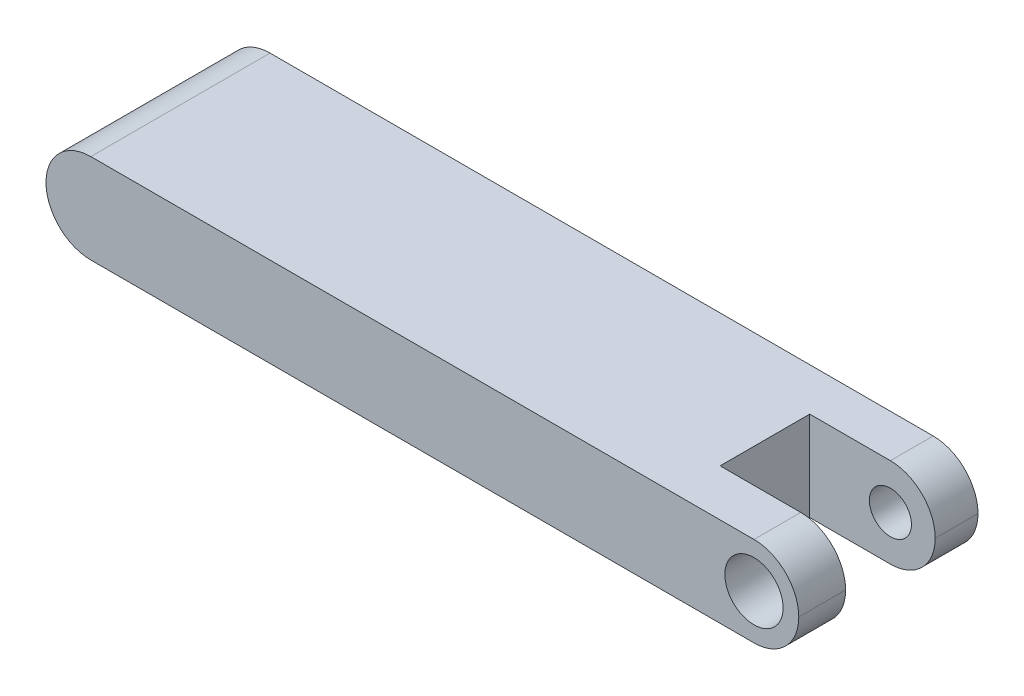
ISO-10303-21;
HEADER;
FILE_DESCRIPTION(('STEP AP214'),'2;1');
FILE_NAME('part.step','',(''),(''),'','','');
FILE_SCHEMA(('AUTOMOTIVE_DESIGN { 1 0 10303 214 1 1 1 1 }'));
ENDSEC;
DATA;
#1=APPLICATION_CONTEXT('core data for automotive mechanical design processes');
#2=APPLICATION_PROTOCOL_DEFINITION('international standard','automotive_design',2000,#1);
#3=PRODUCT_CONTEXT('',#1,'mechanical');
#4=PRODUCT('Part','Part','',(#3));
#5=PRODUCT_RELATED_PRODUCT_CATEGORY('part','',(#4));
#6=PRODUCT_DEFINITION_FORMATION('','',#4);
#7=PRODUCT_DEFINITION_CONTEXT('part definition',#1,'design');
#8=PRODUCT_DEFINITION('design','',#6,#7);
#9=PRODUCT_DEFINITION_SHAPE('','',#8);
#10=(LENGTH_UNIT() NAMED_UNIT(*) SI_UNIT(.MILLI.,.METRE.));
#11=(NAMED_UNIT(*) PLANE_ANGLE_UNIT() SI_UNIT($,.RADIAN.));
#12=(NAMED_UNIT(*) SI_UNIT($,.STERADIAN.) SOLID_ANGLE_UNIT());
#13=UNCERTAINTY_MEASURE_WITH_UNIT(LENGTH_MEASURE(1.E-05),#10,'distance_accuracy_value','');
#14=(GEOMETRIC_REPRESENTATION_CONTEXT(3) GLOBAL_UNCERTAINTY_ASSIGNED_CONTEXT((#13)) GLOBAL_UNIT_ASSIGNED_CONTEXT((#10,
#11,#12)) REPRESENTATION_CONTEXT('',''));
#15=CARTESIAN_POINT('',(0.,0.,0.));
#16=DIRECTION('',(0.,0.,1.));
#17=DIRECTION('',(1.,0.,0.));
#18=AXIS2_PLACEMENT_3D('',#15,#16,#17);
#19=CARTESIAN_POINT('',(11.176,1.27,0.));
#20=DIRECTION('',(0.,0.,1.));
#21=DIRECTION('',(1.,0.,0.));
#22=AXIS2_PLACEMENT_3D('',#19,#20,#21);
#23=CYLINDRICAL_SURFACE('',#22,1.27);
#24=CARTESIAN_POINT('',(11.176,1.27,-3.86681438128154));
#25=DIRECTION('',(0.,0.,-1.));
#26=DIRECTION('',(-1.,0.,0.));
#27=AXIS2_PLACEMENT_3D('',#24,#25,#26);
#28=CIRCLE('',#27,1.27);
#29=CARTESIAN_POINT('',(12.446,1.27,-3.86681438128154));
#30=VERTEX_POINT('',#29);
#31=CARTESIAN_POINT('',(11.176,2.54,-3.86681438128154));
#32=VERTEX_POINT('',#31);
#33=EDGE_CURVE('E158',#30,#32,#28,.F.);
#34=ORIENTED_EDGE('',*,*,#33,.F.);
#35=DIRECTION('',(0.,0.,-1.));
#36=VECTOR('',#35,1.);
#37=CARTESIAN_POINT('',(12.446,1.27,0.));
#38=LINE('',#37,#36);
#39=CARTESIAN_POINT('',(12.446,1.27,-5.08));
#40=VERTEX_POINT('',#39);
#41=EDGE_CURVE('E172',#40,#30,#38,.F.);
#42=ORIENTED_EDGE('',*,*,#41,.F.);
#43=CARTESIAN_POINT('',(11.176,1.27,-5.08));
#44=DIRECTION('',(0.,0.,1.));
#45=DIRECTION('',(1.,0.,0.));
#46=AXIS2_PLACEMENT_3D('',#43,#44,#45);
#47=CIRCLE('',#46,1.27);
#48=CARTESIAN_POINT('',(11.176,2.54,-5.08));
#49=VERTEX_POINT('',#48);
#50=EDGE_CURVE('E178',#49,#40,#47,.F.);
#51=ORIENTED_EDGE('',*,*,#50,.F.);
#52=DIRECTION('',(0.,0.,-1.));
#53=VECTOR('',#52,1.);
#54=CARTESIAN_POINT('',(11.176,2.54,-5.08));
#55=LINE('',#54,#53);
#56=EDGE_CURVE('E197',#32,#49,#55,.T.);
#57=ORIENTED_EDGE('',*,*,#56,.F.);
#58=EDGE_LOOP('',(#34,#42,#51,#57));
#59=FACE_BOUND('',#58,.T.);
#60=ADVANCED_FACE('F36',(#59),#23,.T.);
#61=CARTESIAN_POINT('',(11.176,1.27,0.));
#62=DIRECTION('',(0.,0.,-1.));
#63=DIRECTION('',(-1.,0.,0.));
#64=AXIS2_PLACEMENT_3D('',#61,#62,#63);
#65=CYLINDRICAL_SURFACE('',#64,1.27);
#66=CARTESIAN_POINT('',(11.176,1.27,-3.86681438128154));
#67=DIRECTION('',(0.,0.,-1.));
#68=DIRECTION('',(-1.,0.,0.));
#69=AXIS2_PLACEMENT_3D('',#66,#67,#68);
#70=CIRCLE('',#69,1.27);
#71=CARTESIAN_POINT('',(11.176,0.,-3.86681438128154));
#72=VERTEX_POINT('',#71);
#73=EDGE_CURVE('E11',#72,#30,#70,.F.);
#74=ORIENTED_EDGE('',*,*,#73,.F.);
#75=DIRECTION('',(0.,0.,-1.));
#76=VECTOR('',#75,1.);
#77=CARTESIAN_POINT('',(11.176,0.,0.));
#78=LINE('',#77,#76);
#79=CARTESIAN_POINT('',(11.176,0.,-5.08));
#80=VERTEX_POINT('',#79);
#81=EDGE_CURVE('E144',#80,#72,#78,.F.);
#82=ORIENTED_EDGE('',*,*,#81,.F.);
#83=CARTESIAN_POINT('',(11.176,1.27,-5.08));
#84=DIRECTION('',(0.,0.,1.));
#85=DIRECTION('',(1.,0.,0.));
#86=AXIS2_PLACEMENT_3D('',#83,#84,#85);
#87=CIRCLE('',#86,1.27);
#88=EDGE_CURVE('E180',#40,#80,#87,.F.);
#89=ORIENTED_EDGE('',*,*,#88,.F.);
#90=ORIENTED_EDGE('',*,*,#41,.T.);
#91=EDGE_LOOP('',(#74,#82,#89,#90));
#92=FACE_BOUND('',#91,.T.);
#93=ADVANCED_FACE('F238',(#92),#65,.T.);
#94=CARTESIAN_POINT('',(12.446,2.54,-5.08));
#95=DIRECTION('',(0.,0.,1.));
#96=DIRECTION('',(1.,0.,0.));
#97=AXIS2_PLACEMENT_3D('',#94,#95,#96);
#98=PLANE('',#97);
#99=CARTESIAN_POINT('',(11.176,1.27,-5.08));
#100=DIRECTION('',(0.,0.,1.));
#101=DIRECTION('',(1.,0.,0.));
#102=AXIS2_PLACEMENT_3D('',#99,#100,#101);
#103=CIRCLE('',#102,0.595629999999996);
#104=CARTESIAN_POINT('',(11.77163,1.27,-5.08));
#105=VERTEX_POINT('',#104);
#106=EDGE_CURVE('E280',#105,#105,#103,.T.);
#107=ORIENTED_EDGE('',*,*,#106,.T.);
#108=EDGE_LOOP('',(#107));
#109=FACE_BOUND('',#108,.T.);
#110=ORIENTED_EDGE('',*,*,#50,.T.);
#111=ORIENTED_EDGE('',*,*,#88,.T.);
#112=DIRECTION('',(-1.,0.,0.));
#113=VECTOR('',#112,1.);
#114=CARTESIAN_POINT('',(12.446,0.,-5.08));
#115=LINE('',#114,#113);
#116=CARTESIAN_POINT('',(-7.62,0.,-5.08));
#117=VERTEX_POINT('',#116);
#118=EDGE_CURVE('E169',#80,#117,#115,.T.);
#119=ORIENTED_EDGE('',*,*,#118,.T.);
#120=CARTESIAN_POINT('',(-7.62,1.27,-5.08));
#121=DIRECTION('',(0.,0.,1.));
#122=DIRECTION('',(1.,0.,0.));
#123=AXIS2_PLACEMENT_3D('',#120,#121,#122);
#124=CIRCLE('',#123,1.27);
#125=CARTESIAN_POINT('',(-8.89,1.27,-5.08));
#126=VERTEX_POINT('',#125);
#127=EDGE_CURVE('E176',#117,#126,#124,.F.);
#128=ORIENTED_EDGE('',*,*,#127,.T.);
#129=CARTESIAN_POINT('',(-7.62,1.27,-5.08));
#130=DIRECTION('',(0.,0.,1.));
#131=DIRECTION('',(1.,0.,0.));
#132=AXIS2_PLACEMENT_3D('',#129,#130,#131);
#133=CIRCLE('',#132,1.27);
#134=CARTESIAN_POINT('',(-7.62,2.54,-5.08));
#135=VERTEX_POINT('',#134);
#136=EDGE_CURVE('E168',#126,#135,#133,.F.);
#137=ORIENTED_EDGE('',*,*,#136,.T.);
#138=DIRECTION('',(-1.,0.,0.));
#139=VECTOR('',#138,1.);
#140=CARTESIAN_POINT('',(12.446,2.54,-5.08));
#141=LINE('',#140,#139);
#142=EDGE_CURVE('E161',#49,#135,#141,.T.);
#143=ORIENTED_EDGE('',*,*,#142,.F.);
#144=EDGE_LOOP('',(#110,#111,#119,#128,#137,#143));
#145=FACE_BOUND('',#144,.T.);
#146=ADVANCED_FACE('F221',(#109,#145),#98,.F.);
#147=CARTESIAN_POINT('',(-8.89,2.54,0.));
#148=DIRECTION('',(0.,0.,-1.));
#149=DIRECTION('',(-1.,0.,0.));
#150=AXIS2_PLACEMENT_3D('',#147,#148,#149);
#151=PLANE('',#150);
#152=CARTESIAN_POINT('',(11.176,1.27,0.));
#153=DIRECTION('',(0.,0.,1.));
#154=DIRECTION('',(1.,0.,0.));
#155=AXIS2_PLACEMENT_3D('',#152,#153,#154);
#156=CIRCLE('',#155,0.825499999999989);
#157=CARTESIAN_POINT('',(12.0015,1.27,0.));
#158=VERTEX_POINT('',#157);
#159=EDGE_CURVE('E150',#158,#158,#156,.T.);
#160=ORIENTED_EDGE('',*,*,#159,.F.);
#161=EDGE_LOOP('',(#160));
#162=FACE_BOUND('',#161,.T.);
#163=DIRECTION('',(1.,0.,0.));
#164=VECTOR('',#163,1.);
#165=CARTESIAN_POINT('',(-8.89,0.,0.));
#166=LINE('',#165,#164);
#167=CARTESIAN_POINT('',(-7.62,0.,0.));
#168=VERTEX_POINT('',#167);
#169=CARTESIAN_POINT('',(11.176,0.,0.));
#170=VERTEX_POINT('',#169);
#171=EDGE_CURVE('E165',#168,#170,#166,.T.);
#172=ORIENTED_EDGE('',*,*,#171,.T.);
#173=CARTESIAN_POINT('',(11.176,1.27,0.));
#174=DIRECTION('',(0.,0.,-1.));
#175=DIRECTION('',(-1.,0.,0.));
#176=AXIS2_PLACEMENT_3D('',#173,#174,#175);
#177=CIRCLE('',#176,1.27);
#178=CARTESIAN_POINT('',(12.446,1.27,0.));
#179=VERTEX_POINT('',#178);
#180=EDGE_CURVE('E192',#170,#179,#177,.F.);
#181=ORIENTED_EDGE('',*,*,#180,.T.);
#182=CARTESIAN_POINT('',(11.176,1.27,0.));
#183=DIRECTION('',(0.,0.,-1.));
#184=DIRECTION('',(-1.,0.,0.));
#185=AXIS2_PLACEMENT_3D('',#182,#183,#184);
#186=CIRCLE('',#185,1.27);
#187=CARTESIAN_POINT('',(11.176,2.54,0.));
#188=VERTEX_POINT('',#187);
#189=EDGE_CURVE('E190',#179,#188,#186,.F.);
#190=ORIENTED_EDGE('',*,*,#189,.T.);
#191=DIRECTION('',(1.,0.,0.));
#192=VECTOR('',#191,1.);
#193=CARTESIAN_POINT('',(-8.89,2.54,0.));
#194=LINE('',#193,#192);
#195=CARTESIAN_POINT('',(-7.62,2.54,0.));
#196=VERTEX_POINT('',#195);
#197=EDGE_CURVE('E164',#196,#188,#194,.T.);
#198=ORIENTED_EDGE('',*,*,#197,.F.);
#199=CARTESIAN_POINT('',(-7.62,1.27,0.));
#200=DIRECTION('',(0.,0.,-1.));
#201=DIRECTION('',(-1.,0.,0.));
#202=AXIS2_PLACEMENT_3D('',#199,#200,#201);
#203=CIRCLE('',#202,1.27);
#204=CARTESIAN_POINT('',(-8.89,1.27,0.));
#205=VERTEX_POINT('',#204);
#206=EDGE_CURVE('E60',#196,#205,#203,.F.);
#207=ORIENTED_EDGE('',*,*,#206,.T.);
#208=CARTESIAN_POINT('',(-7.62,1.27,0.));
#209=DIRECTION('',(0.,0.,-1.));
#210=DIRECTION('',(-1.,0.,0.));
#211=AXIS2_PLACEMENT_3D('',#208,#209,#210);
#212=CIRCLE('',#211,1.27);
#213=EDGE_CURVE('E188',#205,#168,#212,.F.);
#214=ORIENTED_EDGE('',*,*,#213,.T.);
#215=EDGE_LOOP('',(#172,#181,#190,#198,#207,#214));
#216=FACE_BOUND('',#215,.T.);
#217=ADVANCED_FACE('F214',(#162,#216),#151,.F.);
#218=CARTESIAN_POINT('',(0.,2.54,0.));
#219=DIRECTION('',(0.,1.,0.));
#220=DIRECTION('',(0.,0.,1.));
#221=AXIS2_PLACEMENT_3D('',#218,#219,#220);
#222=PLANE('',#221);
#223=DIRECTION('',(-1.,0.,0.));
#224=VECTOR('',#223,1.);
#225=CARTESIAN_POINT('',(8.89,2.54,-3.86681438128154));
#226=LINE('',#225,#224);
#227=CARTESIAN_POINT('',(8.89,2.54,-3.86681438128154));
#228=VERTEX_POINT('',#227);
#229=EDGE_CURVE('E126',#32,#228,#226,.T.);
#230=ORIENTED_EDGE('',*,*,#229,.F.);
#231=ORIENTED_EDGE('',*,*,#56,.T.);
#232=ORIENTED_EDGE('',*,*,#142,.T.);
#233=DIRECTION('',(0.,0.,1.));
#234=VECTOR('',#233,1.);
#235=CARTESIAN_POINT('',(-7.62,2.54,0.));
#236=LINE('',#235,#234);
#237=EDGE_CURVE('E195',#135,#196,#236,.T.);
#238=ORIENTED_EDGE('',*,*,#237,.T.);
#239=ORIENTED_EDGE('',*,*,#197,.T.);
#240=CARTESIAN_POINT('',(11.176,2.54,-1.32681438128154));
#241=VERTEX_POINT('',#240);
#242=EDGE_CURVE('E198',#188,#241,#55,.T.);
#243=ORIENTED_EDGE('',*,*,#242,.T.);
#244=DIRECTION('',(1.,0.,0.));
#245=VECTOR('',#244,1.);
#246=CARTESIAN_POINT('',(8.89,2.54,-1.32681438128154));
#247=LINE('',#246,#245);
#248=CARTESIAN_POINT('',(8.89,2.54,-1.32681438128154));
#249=VERTEX_POINT('',#248);
#250=EDGE_CURVE('E145',#249,#241,#247,.T.);
#251=ORIENTED_EDGE('',*,*,#250,.F.);
#252=DIRECTION('',(0.,0.,1.));
#253=VECTOR('',#252,1.);
#254=CARTESIAN_POINT('',(8.89,2.54,-3.86681438128154));
#255=LINE('',#254,#253);
#256=EDGE_CURVE('E147',#228,#249,#255,.T.);
#257=ORIENTED_EDGE('',*,*,#256,.F.);
#258=EDGE_LOOP('',(#230,#231,#232,#238,#239,#243,#251,#257));
#259=FACE_BOUND('',#258,.T.);
#260=ADVANCED_FACE('F226',(#259),#222,.T.);
#261=CARTESIAN_POINT('',(0.,0.,0.));
#262=DIRECTION('',(0.,1.,0.));
#263=DIRECTION('',(0.,0.,1.));
#264=AXIS2_PLACEMENT_3D('',#261,#262,#263);
#265=PLANE('',#264);
#266=ORIENTED_EDGE('',*,*,#81,.T.);
#267=DIRECTION('',(-1.,0.,0.));
#268=VECTOR('',#267,1.);
#269=CARTESIAN_POINT('',(8.89,0.,-3.86681438128154));
#270=LINE('',#269,#268);
#271=CARTESIAN_POINT('',(8.89,0.,-3.86681438128154));
#272=VERTEX_POINT('',#271);
#273=EDGE_CURVE('E123',#72,#272,#270,.T.);
#274=ORIENTED_EDGE('',*,*,#273,.T.);
#275=DIRECTION('',(0.,0.,1.));
#276=VECTOR('',#275,1.);
#277=CARTESIAN_POINT('',(8.89,0.,-3.86681438128154));
#278=LINE('',#277,#276);
#279=CARTESIAN_POINT('',(8.89,0.,-1.32681438128154));
#280=VERTEX_POINT('',#279);
#281=EDGE_CURVE('E134',#272,#280,#278,.T.);
#282=ORIENTED_EDGE('',*,*,#281,.T.);
#283=DIRECTION('',(1.,0.,0.));
#284=VECTOR('',#283,1.);
#285=CARTESIAN_POINT('',(8.89,0.,-1.32681438128154));
#286=LINE('',#285,#284);
#287=CARTESIAN_POINT('',(11.176,0.,-1.32681438128154));
#288=VERTEX_POINT('',#287);
#289=EDGE_CURVE('E131',#280,#288,#286,.T.);
#290=ORIENTED_EDGE('',*,*,#289,.T.);
#291=EDGE_CURVE('E185',#288,#170,#78,.F.);
#292=ORIENTED_EDGE('',*,*,#291,.T.);
#293=ORIENTED_EDGE('',*,*,#171,.F.);
#294=DIRECTION('',(0.,0.,1.));
#295=VECTOR('',#294,1.);
#296=CARTESIAN_POINT('',(-7.62,0.,0.));
#297=LINE('',#296,#295);
#298=EDGE_CURVE('E182',#168,#117,#297,.F.);
#299=ORIENTED_EDGE('',*,*,#298,.T.);
#300=ORIENTED_EDGE('',*,*,#118,.F.);
#301=EDGE_LOOP('',(#266,#274,#282,#290,#292,#293,#299,#300));
#302=FACE_BOUND('',#301,.T.);
#303=ADVANCED_FACE('F141',(#302),#265,.F.);
#304=CARTESIAN_POINT('',(11.176,1.27,-1.32681438128154));
#305=DIRECTION('',(0.,0.,1.));
#306=DIRECTION('',(1.,0.,0.));
#307=AXIS2_PLACEMENT_3D('',#304,#305,#306);
#308=CIRCLE('',#307,1.27);
#309=CARTESIAN_POINT('',(12.446,1.27,-1.32681438128154));
#310=VERTEX_POINT('',#309);
#311=EDGE_CURVE('E52',#241,#310,#308,.F.);
#312=ORIENTED_EDGE('',*,*,#311,.F.);
#313=ORIENTED_EDGE('',*,*,#242,.F.);
#314=ORIENTED_EDGE('',*,*,#189,.F.);
#315=EDGE_CURVE('E203',#310,#179,#38,.F.);
#316=ORIENTED_EDGE('',*,*,#315,.F.);
#317=EDGE_LOOP('',(#312,#313,#314,#316));
#318=FACE_BOUND('',#317,.T.);
#319=ADVANCED_FACE('F229',(#318),#23,.T.);
#320=CARTESIAN_POINT('',(11.176,1.27,-1.32681438128154));
#321=DIRECTION('',(0.,0.,1.));
#322=DIRECTION('',(1.,0.,0.));
#323=AXIS2_PLACEMENT_3D('',#320,#321,#322);
#324=CIRCLE('',#323,1.27);
#325=EDGE_CURVE('E45',#310,#288,#324,.F.);
#326=ORIENTED_EDGE('',*,*,#325,.F.);
#327=ORIENTED_EDGE('',*,*,#315,.T.);
#328=ORIENTED_EDGE('',*,*,#180,.F.);
#329=ORIENTED_EDGE('',*,*,#291,.F.);
#330=EDGE_LOOP('',(#326,#327,#328,#329));
#331=FACE_BOUND('',#330,.T.);
#332=ADVANCED_FACE('F212',(#331),#65,.T.);
#333=CARTESIAN_POINT('',(-7.62,1.27,0.));
#334=DIRECTION('',(0.,0.,-1.));
#335=DIRECTION('',(-1.,0.,0.));
#336=AXIS2_PLACEMENT_3D('',#333,#334,#335);
#337=CYLINDRICAL_SURFACE('',#336,1.27);
#338=ORIENTED_EDGE('',*,*,#237,.F.);
#339=ORIENTED_EDGE('',*,*,#136,.F.);
#340=DIRECTION('',(0.,0.,1.));
#341=VECTOR('',#340,1.);
#342=CARTESIAN_POINT('',(-8.89,1.27,-5.08));
#343=LINE('',#342,#341);
#344=EDGE_CURVE('E160',#205,#126,#343,.F.);
#345=ORIENTED_EDGE('',*,*,#344,.F.);
#346=ORIENTED_EDGE('',*,*,#206,.F.);
#347=EDGE_LOOP('',(#338,#339,#345,#346));
#348=FACE_BOUND('',#347,.T.);
#349=ADVANCED_FACE('F38',(#348),#337,.T.);
#350=CARTESIAN_POINT('',(-7.62,1.27,-5.08));
#351=DIRECTION('',(0.,0.,1.));
#352=DIRECTION('',(1.,0.,0.));
#353=AXIS2_PLACEMENT_3D('',#350,#351,#352);
#354=CYLINDRICAL_SURFACE('',#353,1.27);
#355=ORIENTED_EDGE('',*,*,#127,.F.);
#356=ORIENTED_EDGE('',*,*,#298,.F.);
#357=ORIENTED_EDGE('',*,*,#213,.F.);
#358=ORIENTED_EDGE('',*,*,#344,.T.);
#359=EDGE_LOOP('',(#355,#356,#357,#358));
#360=FACE_BOUND('',#359,.T.);
#361=ADVANCED_FACE('F218',(#360),#354,.T.);
#362=CARTESIAN_POINT('',(8.89,0.,-3.86681438128154));
#363=DIRECTION('',(0.,0.,-1.));
#364=DIRECTION('',(-1.,0.,0.));
#365=AXIS2_PLACEMENT_3D('',#362,#363,#364);
#366=PLANE('',#365);
#367=CARTESIAN_POINT('',(11.176,1.27,-3.86681438128154));
#368=DIRECTION('',(0.,0.,1.));
#369=DIRECTION('',(1.,0.,0.));
#370=AXIS2_PLACEMENT_3D('',#367,#368,#369);
#371=CIRCLE('',#370,0.595629999999996);
#372=CARTESIAN_POINT('',(11.77163,1.27,-3.86681438128154));
#373=VERTEX_POINT('',#372);
#374=EDGE_CURVE('E283',#373,#373,#371,.T.);
#375=ORIENTED_EDGE('',*,*,#374,.F.);
#376=EDGE_LOOP('',(#375));
#377=FACE_BOUND('',#376,.T.);
#378=ORIENTED_EDGE('',*,*,#33,.T.);
#379=ORIENTED_EDGE('',*,*,#229,.T.);
#380=DIRECTION('',(0.,1.,0.));
#381=VECTOR('',#380,1.);
#382=CARTESIAN_POINT('',(8.89,0.,-3.86681438128154));
#383=LINE('',#382,#381);
#384=EDGE_CURVE('E119',#272,#228,#383,.T.);
#385=ORIENTED_EDGE('',*,*,#384,.F.);
#386=ORIENTED_EDGE('',*,*,#273,.F.);
#387=ORIENTED_EDGE('',*,*,#73,.T.);
#388=EDGE_LOOP('',(#378,#379,#385,#386,#387));
#389=FACE_BOUND('',#388,.T.);
#390=ADVANCED_FACE('F121',(#377,#389),#366,.F.);
#391=CARTESIAN_POINT('',(8.89,0.,-1.32681438128154));
#392=DIRECTION('',(0.,0.,1.));
#393=DIRECTION('',(1.,0.,0.));
#394=AXIS2_PLACEMENT_3D('',#391,#392,#393);
#395=PLANE('',#394);
#396=CARTESIAN_POINT('',(11.176,1.27,-1.32681438128154));
#397=DIRECTION('',(0.,0.,1.));
#398=DIRECTION('',(1.,0.,0.));
#399=AXIS2_PLACEMENT_3D('',#396,#397,#398);
#400=CIRCLE('',#399,0.825499999999995);
#401=CARTESIAN_POINT('',(12.0015,1.27,-1.32681438128154));
#402=VERTEX_POINT('',#401);
#403=EDGE_CURVE('E40',#402,#402,#400,.T.);
#404=ORIENTED_EDGE('',*,*,#403,.T.);
#405=EDGE_LOOP('',(#404));
#406=FACE_BOUND('',#405,.T.);
#407=ORIENTED_EDGE('',*,*,#311,.T.);
#408=ORIENTED_EDGE('',*,*,#325,.T.);
#409=ORIENTED_EDGE('',*,*,#289,.F.);
#410=DIRECTION('',(0.,1.,0.));
#411=VECTOR('',#410,1.);
#412=CARTESIAN_POINT('',(8.89,0.,-1.32681438128154));
#413=LINE('',#412,#411);
#414=EDGE_CURVE('E130',#280,#249,#413,.T.);
#415=ORIENTED_EDGE('',*,*,#414,.T.);
#416=ORIENTED_EDGE('',*,*,#250,.T.);
#417=EDGE_LOOP('',(#407,#408,#409,#415,#416));
#418=FACE_BOUND('',#417,.T.);
#419=ADVANCED_FACE('F206',(#406,#418),#395,.F.);
#420=CARTESIAN_POINT('',(8.89,0.,-3.86681438128154));
#421=DIRECTION('',(-1.,0.,0.));
#422=DIRECTION('',(0.,0.,1.));
#423=AXIS2_PLACEMENT_3D('',#420,#421,#422);
#424=PLANE('',#423);
#425=ORIENTED_EDGE('',*,*,#256,.T.);
#426=ORIENTED_EDGE('',*,*,#414,.F.);
#427=ORIENTED_EDGE('',*,*,#281,.F.);
#428=ORIENTED_EDGE('',*,*,#384,.T.);
#429=EDGE_LOOP('',(#425,#426,#427,#428));
#430=FACE_BOUND('',#429,.T.);
#431=ADVANCED_FACE('F135',(#430),#424,.F.);
#432=CARTESIAN_POINT('',(11.176,1.27,0.));
#433=DIRECTION('',(0.,0.,1.));
#434=DIRECTION('',(1.,0.,0.));
#435=AXIS2_PLACEMENT_3D('',#432,#433,#434);
#436=CYLINDRICAL_SURFACE('',#435,0.825499999999995);
#437=ORIENTED_EDGE('',*,*,#159,.T.);
#438=EDGE_LOOP('',(#437));
#439=FACE_BOUND('',#438,.T.);
#440=ORIENTED_EDGE('',*,*,#403,.F.);
#441=EDGE_LOOP('',(#440));
#442=FACE_BOUND('',#441,.T.);
#443=ADVANCED_FACE('F291',(#439,#442),#436,.F.);
#444=CARTESIAN_POINT('',(11.176,1.27,-3.86681438128154));
#445=DIRECTION('',(0.,0.,1.));
#446=DIRECTION('',(1.,0.,0.));
#447=AXIS2_PLACEMENT_3D('',#444,#445,#446);
#448=CYLINDRICAL_SURFACE('',#447,0.595629999999996);
#449=ORIENTED_EDGE('',*,*,#374,.T.);
#450=EDGE_LOOP('',(#449));
#451=FACE_BOUND('',#450,.T.);
#452=ORIENTED_EDGE('',*,*,#106,.F.);
#453=EDGE_LOOP('',(#452));
#454=FACE_BOUND('',#453,.T.);
#455=ADVANCED_FACE('F288',(#451,#454),#448,.F.);
#456=CLOSED_SHELL('',(#60,#93,#146,#217,#260,#303,#319,#332,#349,#361,#390,#419,#431,#443,#455));
#457=MANIFOLD_SOLID_BREP('B2',#456);
#458=ADVANCED_BREP_SHAPE_REPRESENTATION('',(#18,#457),#14);
#459=SHAPE_DEFINITION_REPRESENTATION(#9,#458);
ENDSEC;
END-ISO-10303-21;
